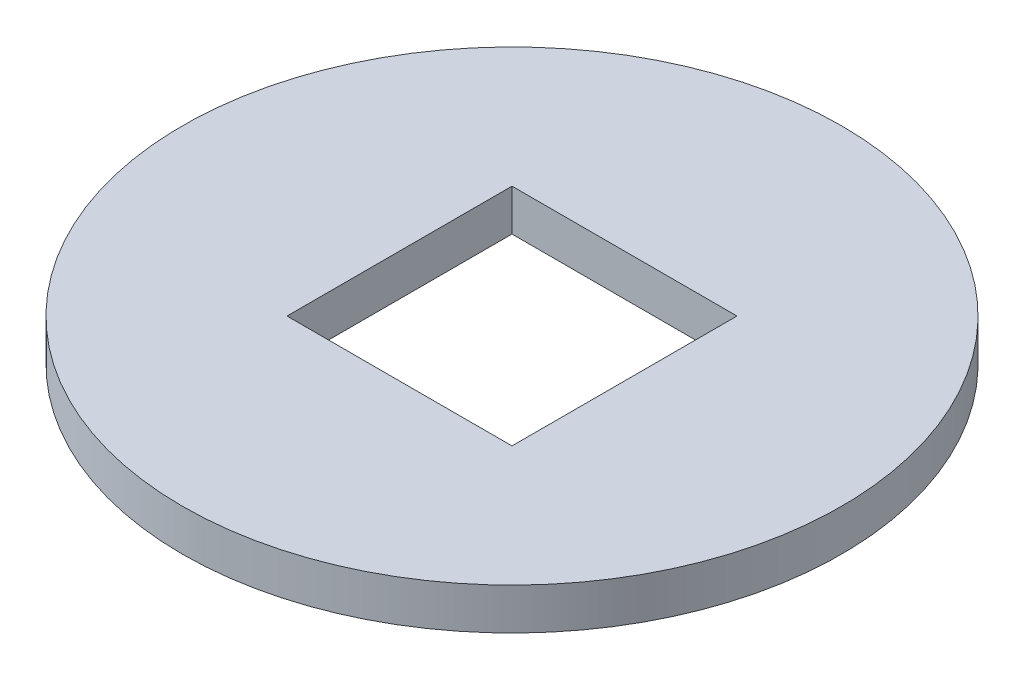
ISO-10303-21;
HEADER;
FILE_DESCRIPTION(('STEP AP214'),'2;1');
FILE_NAME('part.step','',(''),(''),'','','');
FILE_SCHEMA(('AUTOMOTIVE_DESIGN { 1 0 10303 214 1 1 1 1 }'));
ENDSEC;
DATA;
#1=APPLICATION_CONTEXT('core data for automotive mechanical design processes');
#2=APPLICATION_PROTOCOL_DEFINITION('international standard','automotive_design',2000,#1);
#3=PRODUCT_CONTEXT('',#1,'mechanical');
#4=PRODUCT('Part','Part','',(#3));
#5=PRODUCT_RELATED_PRODUCT_CATEGORY('part','',(#4));
#6=PRODUCT_DEFINITION_FORMATION('','',#4);
#7=PRODUCT_DEFINITION_CONTEXT('part definition',#1,'design');
#8=PRODUCT_DEFINITION('design','',#6,#7);
#9=PRODUCT_DEFINITION_SHAPE('','',#8);
#10=(LENGTH_UNIT() NAMED_UNIT(*) SI_UNIT(.MILLI.,.METRE.));
#11=(NAMED_UNIT(*) PLANE_ANGLE_UNIT() SI_UNIT($,.RADIAN.));
#12=(NAMED_UNIT(*) SI_UNIT($,.STERADIAN.) SOLID_ANGLE_UNIT());
#13=UNCERTAINTY_MEASURE_WITH_UNIT(LENGTH_MEASURE(1.E-05),#10,'distance_accuracy_value','');
#14=(GEOMETRIC_REPRESENTATION_CONTEXT(3) GLOBAL_UNCERTAINTY_ASSIGNED_CONTEXT((#13)) GLOBAL_UNIT_ASSIGNED_CONTEXT((#10,
#11,#12)) REPRESENTATION_CONTEXT('',''));
#15=CARTESIAN_POINT('',(0.,0.,0.));
#16=DIRECTION('',(0.,0.,1.));
#17=DIRECTION('',(1.,0.,0.));
#18=AXIS2_PLACEMENT_3D('',#15,#16,#17);
#19=CARTESIAN_POINT('',(0.,0.6,0.));
#20=DIRECTION('',(0.,1.,0.));
#21=DIRECTION('',(0.,0.,1.));
#22=AXIS2_PLACEMENT_3D('',#19,#20,#21);
#23=PLANE('',#22);
#24=CARTESIAN_POINT('',(0.,0.6,0.));
#25=DIRECTION('',(0.,1.,0.));
#26=DIRECTION('',(0.,0.,1.));
#27=AXIS2_PLACEMENT_3D('',#24,#25,#26);
#28=CIRCLE('',#27,4.7625);
#29=CARTESIAN_POINT('',(0.,0.6,4.7625));
#30=VERTEX_POINT('',#29);
#31=EDGE_CURVE('E11',#30,#30,#28,.T.);
#32=ORIENTED_EDGE('',*,*,#31,.T.);
#33=EDGE_LOOP('',(#32));
#34=FACE_BOUND('',#33,.T.);
#35=DIRECTION('',(-1.,0.,0.));
#36=VECTOR('',#35,1.);
#37=CARTESIAN_POINT('',(-1.6256,0.6,-1.6256));
#38=LINE('',#37,#36);
#39=CARTESIAN_POINT('',(1.6256,0.6,-1.6256));
#40=VERTEX_POINT('',#39);
#41=CARTESIAN_POINT('',(-1.6256,0.6,-1.6256));
#42=VERTEX_POINT('',#41);
#43=EDGE_CURVE('E82',#40,#42,#38,.T.);
#44=ORIENTED_EDGE('',*,*,#43,.F.);
#45=DIRECTION('',(0.,0.,-1.));
#46=VECTOR('',#45,1.);
#47=CARTESIAN_POINT('',(1.6256,0.6,1.6256));
#48=LINE('',#47,#46);
#49=CARTESIAN_POINT('',(1.6256,0.6,1.6256));
#50=VERTEX_POINT('',#49);
#51=EDGE_CURVE('E74',#50,#40,#48,.T.);
#52=ORIENTED_EDGE('',*,*,#51,.F.);
#53=DIRECTION('',(1.,0.,0.));
#54=VECTOR('',#53,1.);
#55=CARTESIAN_POINT('',(-1.6256,0.6,1.6256));
#56=LINE('',#55,#54);
#57=CARTESIAN_POINT('',(-1.6256,0.6,1.6256));
#58=VERTEX_POINT('',#57);
#59=EDGE_CURVE('E95',#58,#50,#56,.T.);
#60=ORIENTED_EDGE('',*,*,#59,.F.);
#61=DIRECTION('',(0.,0.,1.));
#62=VECTOR('',#61,1.);
#63=CARTESIAN_POINT('',(-1.6256,0.6,1.6256));
#64=LINE('',#63,#62);
#65=EDGE_CURVE('E93',#42,#58,#64,.T.);
#66=ORIENTED_EDGE('',*,*,#65,.F.);
#67=EDGE_LOOP('',(#44,#52,#60,#66));
#68=FACE_BOUND('',#67,.T.);
#69=ADVANCED_FACE('F33',(#34,#68),#23,.T.);
#70=CARTESIAN_POINT('',(0.,0.,0.));
#71=DIRECTION('',(0.,1.,0.));
#72=DIRECTION('',(0.,0.,1.));
#73=AXIS2_PLACEMENT_3D('',#70,#71,#72);
#74=PLANE('',#73);
#75=CARTESIAN_POINT('',(0.,0.,0.));
#76=DIRECTION('',(0.,1.,0.));
#77=DIRECTION('',(0.,0.,1.));
#78=AXIS2_PLACEMENT_3D('',#75,#76,#77);
#79=CIRCLE('',#78,4.7625);
#80=CARTESIAN_POINT('',(0.,0.,4.7625));
#81=VERTEX_POINT('',#80);
#82=EDGE_CURVE('E37',#81,#81,#79,.T.);
#83=ORIENTED_EDGE('',*,*,#82,.F.);
#84=EDGE_LOOP('',(#83));
#85=FACE_BOUND('',#84,.T.);
#86=DIRECTION('',(0.,0.,-1.));
#87=VECTOR('',#86,1.);
#88=CARTESIAN_POINT('',(1.6256,0.,1.6256));
#89=LINE('',#88,#87);
#90=CARTESIAN_POINT('',(1.6256,0.,1.6256));
#91=VERTEX_POINT('',#90);
#92=CARTESIAN_POINT('',(1.6256,0.,-1.6256));
#93=VERTEX_POINT('',#92);
#94=EDGE_CURVE('E56',#91,#93,#89,.T.);
#95=ORIENTED_EDGE('',*,*,#94,.T.);
#96=DIRECTION('',(-1.,0.,0.));
#97=VECTOR('',#96,1.);
#98=CARTESIAN_POINT('',(-1.6256,0.,-1.6256));
#99=LINE('',#98,#97);
#100=CARTESIAN_POINT('',(-1.6256,0.,-1.6256));
#101=VERTEX_POINT('',#100);
#102=EDGE_CURVE('E89',#93,#101,#99,.T.);
#103=ORIENTED_EDGE('',*,*,#102,.T.);
#104=DIRECTION('',(0.,0.,1.));
#105=VECTOR('',#104,1.);
#106=CARTESIAN_POINT('',(-1.6256,0.,1.6256));
#107=LINE('',#106,#105);
#108=CARTESIAN_POINT('',(-1.6256,0.,1.6256));
#109=VERTEX_POINT('',#108);
#110=EDGE_CURVE('E101',#101,#109,#107,.T.);
#111=ORIENTED_EDGE('',*,*,#110,.T.);
#112=DIRECTION('',(1.,0.,0.));
#113=VECTOR('',#112,1.);
#114=CARTESIAN_POINT('',(-1.6256,0.,1.6256));
#115=LINE('',#114,#113);
#116=EDGE_CURVE('E83',#109,#91,#115,.T.);
#117=ORIENTED_EDGE('',*,*,#116,.T.);
#118=EDGE_LOOP('',(#95,#103,#111,#117));
#119=FACE_BOUND('',#118,.T.);
#120=ADVANCED_FACE('F112',(#85,#119),#74,.F.);
#121=CARTESIAN_POINT('',(0.,0.6,0.));
#122=DIRECTION('',(0.,-1.,0.));
#123=DIRECTION('',(0.,0.,-1.));
#124=AXIS2_PLACEMENT_3D('',#121,#122,#123);
#125=CYLINDRICAL_SURFACE('',#124,4.7625);
#126=ORIENTED_EDGE('',*,*,#31,.F.);
#127=EDGE_LOOP('',(#126));
#128=FACE_BOUND('',#127,.T.);
#129=ORIENTED_EDGE('',*,*,#82,.T.);
#130=EDGE_LOOP('',(#129));
#131=FACE_BOUND('',#130,.T.);
#132=ADVANCED_FACE('F35',(#128,#131),#125,.T.);
#133=CARTESIAN_POINT('',(1.6256,0.6,1.6256));
#134=DIRECTION('',(-1.,0.,0.));
#135=DIRECTION('',(0.,0.,1.));
#136=AXIS2_PLACEMENT_3D('',#133,#134,#135);
#137=PLANE('',#136);
#138=ORIENTED_EDGE('',*,*,#94,.F.);
#139=DIRECTION('',(0.,-1.,0.));
#140=VECTOR('',#139,1.);
#141=CARTESIAN_POINT('',(1.6256,0.6,1.6256));
#142=LINE('',#141,#140);
#143=EDGE_CURVE('E78',#50,#91,#142,.T.);
#144=ORIENTED_EDGE('',*,*,#143,.F.);
#145=ORIENTED_EDGE('',*,*,#51,.T.);
#146=DIRECTION('',(0.,-1.,0.));
#147=VECTOR('',#146,1.);
#148=CARTESIAN_POINT('',(1.6256,0.6,-1.6256));
#149=LINE('',#148,#147);
#150=EDGE_CURVE('E77',#40,#93,#149,.T.);
#151=ORIENTED_EDGE('',*,*,#150,.T.);
#152=EDGE_LOOP('',(#138,#144,#145,#151));
#153=FACE_BOUND('',#152,.T.);
#154=ADVANCED_FACE('F76',(#153),#137,.T.);
#155=CARTESIAN_POINT('',(-1.6256,0.6,-1.6256));
#156=DIRECTION('',(0.,0.,1.));
#157=DIRECTION('',(1.,0.,0.));
#158=AXIS2_PLACEMENT_3D('',#155,#156,#157);
#159=PLANE('',#158);
#160=ORIENTED_EDGE('',*,*,#102,.F.);
#161=ORIENTED_EDGE('',*,*,#150,.F.);
#162=ORIENTED_EDGE('',*,*,#43,.T.);
#163=DIRECTION('',(0.,-1.,0.));
#164=VECTOR('',#163,1.);
#165=CARTESIAN_POINT('',(-1.6256,0.6,-1.6256));
#166=LINE('',#165,#164);
#167=EDGE_CURVE('E90',#42,#101,#166,.T.);
#168=ORIENTED_EDGE('',*,*,#167,.T.);
#169=EDGE_LOOP('',(#160,#161,#162,#168));
#170=FACE_BOUND('',#169,.T.);
#171=ADVANCED_FACE('F86',(#170),#159,.T.);
#172=CARTESIAN_POINT('',(-1.6256,0.6,1.6256));
#173=DIRECTION('',(1.,0.,0.));
#174=DIRECTION('',(0.,0.,-1.));
#175=AXIS2_PLACEMENT_3D('',#172,#173,#174);
#176=PLANE('',#175);
#177=ORIENTED_EDGE('',*,*,#110,.F.);
#178=ORIENTED_EDGE('',*,*,#167,.F.);
#179=ORIENTED_EDGE('',*,*,#65,.T.);
#180=DIRECTION('',(0.,-1.,0.));
#181=VECTOR('',#180,1.);
#182=CARTESIAN_POINT('',(-1.6256,0.6,1.6256));
#183=LINE('',#182,#181);
#184=EDGE_CURVE('E48',#58,#109,#183,.T.);
#185=ORIENTED_EDGE('',*,*,#184,.T.);
#186=EDGE_LOOP('',(#177,#178,#179,#185));
#187=FACE_BOUND('',#186,.T.);
#188=ADVANCED_FACE('F110',(#187),#176,.T.);
#189=CARTESIAN_POINT('',(-1.6256,0.6,1.6256));
#190=DIRECTION('',(0.,0.,-1.));
#191=DIRECTION('',(-1.,0.,0.));
#192=AXIS2_PLACEMENT_3D('',#189,#190,#191);
#193=PLANE('',#192);
#194=ORIENTED_EDGE('',*,*,#116,.F.);
#195=ORIENTED_EDGE('',*,*,#184,.F.);
#196=ORIENTED_EDGE('',*,*,#59,.T.);
#197=ORIENTED_EDGE('',*,*,#143,.T.);
#198=EDGE_LOOP('',(#194,#195,#196,#197));
#199=FACE_BOUND('',#198,.T.);
#200=ADVANCED_FACE('F113',(#199),#193,.T.);
#201=CLOSED_SHELL('',(#69,#120,#132,#154,#171,#188,#200));
#202=MANIFOLD_SOLID_BREP('B2',#201);
#203=ADVANCED_BREP_SHAPE_REPRESENTATION('',(#18,#202),#14);
#204=SHAPE_DEFINITION_REPRESENTATION(#9,#203);
ENDSEC;
END-ISO-10303-21;
